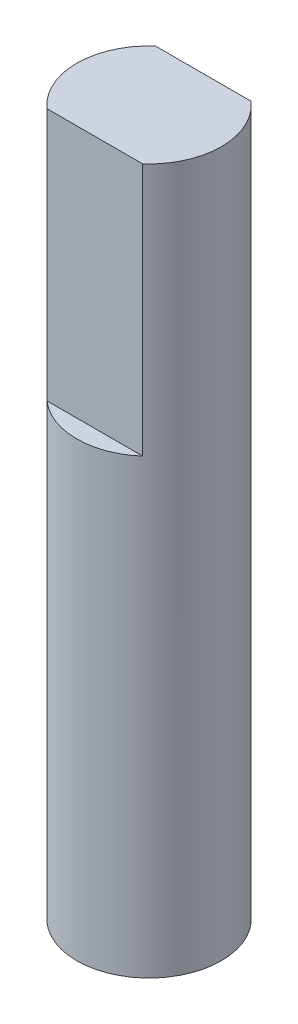
ISO-10303-21;
HEADER;
FILE_DESCRIPTION(('STEP AP214'),'2;1');
FILE_NAME('part.step','',(''),(''),'','','');
FILE_SCHEMA(('AUTOMOTIVE_DESIGN { 1 0 10303 214 1 1 1 1 }'));
ENDSEC;
DATA;
#1=APPLICATION_CONTEXT('core data for automotive mechanical design processes');
#2=APPLICATION_PROTOCOL_DEFINITION('international standard','automotive_design',2000,#1);
#3=PRODUCT_CONTEXT('',#1,'mechanical');
#4=PRODUCT('Part','Part','',(#3));
#5=PRODUCT_RELATED_PRODUCT_CATEGORY('part','',(#4));
#6=PRODUCT_DEFINITION_FORMATION('','',#4);
#7=PRODUCT_DEFINITION_CONTEXT('part definition',#1,'design');
#8=PRODUCT_DEFINITION('design','',#6,#7);
#9=PRODUCT_DEFINITION_SHAPE('','',#8);
#10=(LENGTH_UNIT() NAMED_UNIT(*) SI_UNIT(.MILLI.,.METRE.));
#11=(NAMED_UNIT(*) PLANE_ANGLE_UNIT() SI_UNIT($,.RADIAN.));
#12=(NAMED_UNIT(*) SI_UNIT($,.STERADIAN.) SOLID_ANGLE_UNIT());
#13=UNCERTAINTY_MEASURE_WITH_UNIT(LENGTH_MEASURE(1.E-05),#10,'distance_accuracy_value','');
#14=(GEOMETRIC_REPRESENTATION_CONTEXT(3) GLOBAL_UNCERTAINTY_ASSIGNED_CONTEXT((#13)) GLOBAL_UNIT_ASSIGNED_CONTEXT((#10,
#11,#12)) REPRESENTATION_CONTEXT('',''));
#15=CARTESIAN_POINT('',(0.,0.,0.));
#16=DIRECTION('',(0.,0.,1.));
#17=DIRECTION('',(1.,0.,0.));
#18=AXIS2_PLACEMENT_3D('',#15,#16,#17);
#19=CARTESIAN_POINT('',(0.,25.,0.));
#20=DIRECTION('',(0.,1.,0.));
#21=DIRECTION('',(0.,0.,1.));
#22=AXIS2_PLACEMENT_3D('',#19,#20,#21);
#23=PLANE('',#22);
#24=DIRECTION('',(1.,0.,0.));
#25=VECTOR('',#24,1.);
#26=CARTESIAN_POINT('',(-2.64575131106459,25.,3.));
#27=LINE('',#26,#25);
#28=CARTESIAN_POINT('',(-2.64575131106459,25.,3.));
#29=VERTEX_POINT('',#28);
#30=CARTESIAN_POINT('',(2.64575131106459,25.,3.));
#31=VERTEX_POINT('',#30);
#32=EDGE_CURVE('E59',#29,#31,#27,.T.);
#33=ORIENTED_EDGE('',*,*,#32,.F.);
#34=CARTESIAN_POINT('',(0.,25.,0.));
#35=DIRECTION('',(0.,1.,0.));
#36=DIRECTION('',(0.,0.,1.));
#37=AXIS2_PLACEMENT_3D('',#34,#35,#36);
#38=CIRCLE('',#37,4.);
#39=EDGE_CURVE('E53',#29,#31,#38,.T.);
#40=ORIENTED_EDGE('',*,*,#39,.T.);
#41=EDGE_LOOP('',(#33,#40));
#42=FACE_BOUND('',#41,.T.);
#43=ADVANCED_FACE('F43',(#42),#23,.T.);
#44=CARTESIAN_POINT('',(0.,25.,0.));
#45=DIRECTION('',(0.,-1.,0.));
#46=DIRECTION('',(0.,0.,-1.));
#47=AXIS2_PLACEMENT_3D('',#44,#45,#46);
#48=CYLINDRICAL_SURFACE('',#47,4.);
#49=CARTESIAN_POINT('',(2.64575131106459,25.,-3.));
#50=VERTEX_POINT('',#49);
#51=CARTESIAN_POINT('',(-2.64575131106459,25.,-3.));
#52=VERTEX_POINT('',#51);
#53=EDGE_CURVE('E11',#50,#52,#38,.T.);
#54=ORIENTED_EDGE('',*,*,#53,.F.);
#55=DIRECTION('',(0.,-1.,0.));
#56=VECTOR('',#55,1.);
#57=CARTESIAN_POINT('',(2.64575131106459,39.,-3.));
#58=LINE('',#57,#56);
#59=CARTESIAN_POINT('',(2.64575131106459,39.,-3.));
#60=VERTEX_POINT('',#59);
#61=EDGE_CURVE('E89',#60,#50,#58,.T.);
#62=ORIENTED_EDGE('',*,*,#61,.F.);
#63=CARTESIAN_POINT('',(0.,39.,0.));
#64=DIRECTION('',(0.,1.,0.));
#65=DIRECTION('',(0.,0.,1.));
#66=AXIS2_PLACEMENT_3D('',#63,#64,#65);
#67=CIRCLE('',#66,4.);
#68=CARTESIAN_POINT('',(2.64575131106459,39.,3.));
#69=VERTEX_POINT('',#68);
#70=EDGE_CURVE('E96',#69,#60,#67,.T.);
#71=ORIENTED_EDGE('',*,*,#70,.F.);
#72=DIRECTION('',(0.,-1.,0.));
#73=VECTOR('',#72,1.);
#74=CARTESIAN_POINT('',(2.64575131106459,39.,3.));
#75=LINE('',#74,#73);
#76=EDGE_CURVE('E121',#69,#31,#75,.T.);
#77=ORIENTED_EDGE('',*,*,#76,.T.);
#78=ORIENTED_EDGE('',*,*,#39,.F.);
#79=DIRECTION('',(0.,-1.,0.));
#80=VECTOR('',#79,1.);
#81=CARTESIAN_POINT('',(-2.64575131106459,39.,3.));
#82=LINE('',#81,#80);
#83=CARTESIAN_POINT('',(-2.64575131106459,39.,3.));
#84=VERTEX_POINT('',#83);
#85=EDGE_CURVE('E113',#84,#29,#82,.T.);
#86=ORIENTED_EDGE('',*,*,#85,.F.);
#87=CARTESIAN_POINT('',(0.,39.,0.));
#88=DIRECTION('',(0.,1.,0.));
#89=DIRECTION('',(0.,0.,1.));
#90=AXIS2_PLACEMENT_3D('',#87,#88,#89);
#91=CIRCLE('',#90,4.);
#92=CARTESIAN_POINT('',(-2.64575131106459,39.,-3.));
#93=VERTEX_POINT('',#92);
#94=EDGE_CURVE('E95',#93,#84,#91,.T.);
#95=ORIENTED_EDGE('',*,*,#94,.F.);
#96=DIRECTION('',(0.,-1.,0.));
#97=VECTOR('',#96,1.);
#98=CARTESIAN_POINT('',(-2.64575131106459,39.,-3.));
#99=LINE('',#98,#97);
#100=EDGE_CURVE('E91',#93,#52,#99,.T.);
#101=ORIENTED_EDGE('',*,*,#100,.T.);
#102=EDGE_LOOP('',(#54,#62,#71,#77,#78,#86,#95,#101));
#103=FACE_BOUND('',#102,.T.);
#104=CARTESIAN_POINT('',(0.,0.,0.));
#105=DIRECTION('',(0.,1.,0.));
#106=DIRECTION('',(0.,0.,1.));
#107=AXIS2_PLACEMENT_3D('',#104,#105,#106);
#108=CIRCLE('',#107,4.);
#109=CARTESIAN_POINT('',(0.,0.,4.));
#110=VERTEX_POINT('',#109);
#111=EDGE_CURVE('E47',#110,#110,#108,.T.);
#112=ORIENTED_EDGE('',*,*,#111,.T.);
#113=EDGE_LOOP('',(#112));
#114=FACE_BOUND('',#113,.T.);
#115=ADVANCED_FACE('F45',(#103,#114),#48,.T.);
#116=DIRECTION('',(-1.,0.,0.));
#117=VECTOR('',#116,1.);
#118=CARTESIAN_POINT('',(-2.64575131106459,25.,-3.));
#119=LINE('',#118,#117);
#120=EDGE_CURVE('E65',#50,#52,#119,.T.);
#121=ORIENTED_EDGE('',*,*,#120,.F.);
#122=ORIENTED_EDGE('',*,*,#53,.T.);
#123=EDGE_LOOP('',(#121,#122));
#124=FACE_BOUND('',#123,.T.);
#125=ADVANCED_FACE('F144',(#124),#23,.T.);
#126=CARTESIAN_POINT('',(0.,0.,0.));
#127=DIRECTION('',(0.,1.,0.));
#128=DIRECTION('',(0.,0.,1.));
#129=AXIS2_PLACEMENT_3D('',#126,#127,#128);
#130=PLANE('',#129);
#131=ORIENTED_EDGE('',*,*,#111,.F.);
#132=EDGE_LOOP('',(#131));
#133=FACE_BOUND('',#132,.T.);
#134=ADVANCED_FACE('F140',(#133),#130,.F.);
#135=CARTESIAN_POINT('',(-2.64575131106459,39.,-3.));
#136=DIRECTION('',(0.,0.,1.));
#137=DIRECTION('',(1.,0.,0.));
#138=AXIS2_PLACEMENT_3D('',#135,#136,#137);
#139=PLANE('',#138);
#140=ORIENTED_EDGE('',*,*,#120,.T.);
#141=ORIENTED_EDGE('',*,*,#100,.F.);
#142=DIRECTION('',(-1.,0.,0.));
#143=VECTOR('',#142,1.);
#144=CARTESIAN_POINT('',(-2.64575131106459,39.,-3.));
#145=LINE('',#144,#143);
#146=EDGE_CURVE('E85',#60,#93,#145,.T.);
#147=ORIENTED_EDGE('',*,*,#146,.F.);
#148=ORIENTED_EDGE('',*,*,#61,.T.);
#149=EDGE_LOOP('',(#140,#141,#147,#148));
#150=FACE_BOUND('',#149,.T.);
#151=ADVANCED_FACE('F87',(#150),#139,.F.);
#152=CARTESIAN_POINT('',(-2.64575131106459,39.,3.));
#153=DIRECTION('',(0.,0.,-1.));
#154=DIRECTION('',(-1.,0.,0.));
#155=AXIS2_PLACEMENT_3D('',#152,#153,#154);
#156=PLANE('',#155);
#157=ORIENTED_EDGE('',*,*,#32,.T.);
#158=ORIENTED_EDGE('',*,*,#76,.F.);
#159=DIRECTION('',(1.,0.,0.));
#160=VECTOR('',#159,1.);
#161=CARTESIAN_POINT('',(-2.64575131106459,39.,3.));
#162=LINE('',#161,#160);
#163=EDGE_CURVE('E101',#84,#69,#162,.T.);
#164=ORIENTED_EDGE('',*,*,#163,.F.);
#165=ORIENTED_EDGE('',*,*,#85,.T.);
#166=EDGE_LOOP('',(#157,#158,#164,#165));
#167=FACE_BOUND('',#166,.T.);
#168=ADVANCED_FACE('F120',(#167),#156,.F.);
#169=CARTESIAN_POINT('',(0.,39.,0.));
#170=DIRECTION('',(0.,1.,0.));
#171=DIRECTION('',(0.,0.,1.));
#172=AXIS2_PLACEMENT_3D('',#169,#170,#171);
#173=PLANE('',#172);
#174=ORIENTED_EDGE('',*,*,#70,.T.);
#175=ORIENTED_EDGE('',*,*,#146,.T.);
#176=ORIENTED_EDGE('',*,*,#94,.T.);
#177=ORIENTED_EDGE('',*,*,#163,.T.);
#178=EDGE_LOOP('',(#174,#175,#176,#177));
#179=FACE_BOUND('',#178,.T.);
#180=ADVANCED_FACE('F99',(#179),#173,.T.);
#181=CLOSED_SHELL('',(#43,#115,#125,#134,#151,#168,#180));
#182=MANIFOLD_SOLID_BREP('B2',#181);
#183=ADVANCED_BREP_SHAPE_REPRESENTATION('',(#18,#182),#14);
#184=SHAPE_DEFINITION_REPRESENTATION(#9,#183);
ENDSEC;
END-ISO-10303-21;
